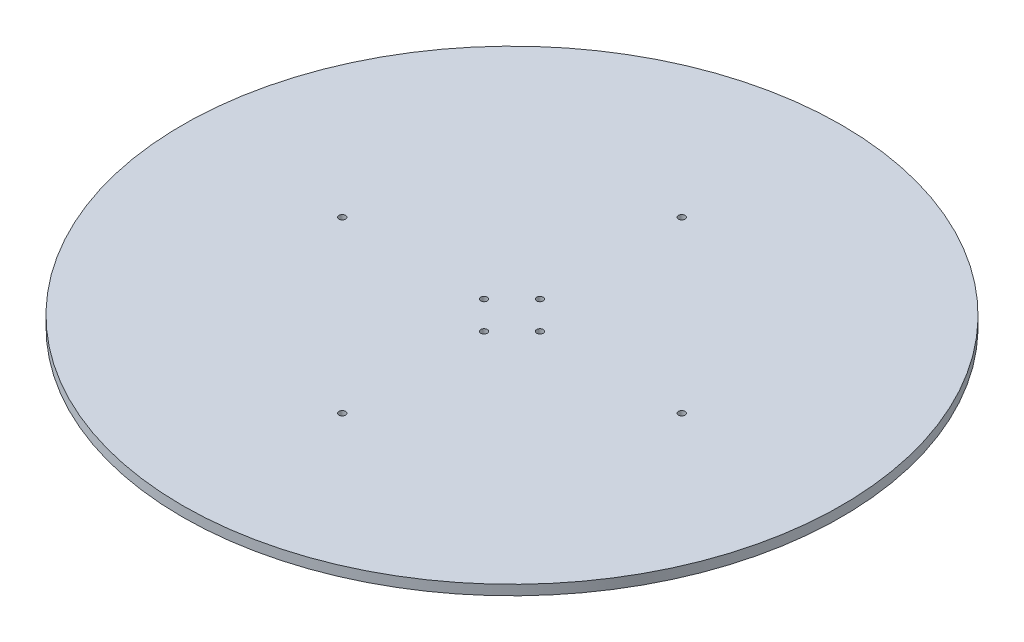
ISO-10303-21;
HEADER;
FILE_DESCRIPTION(('STEP AP214'),'2;1');
FILE_NAME('part.step','',(''),(''),'','','');
FILE_SCHEMA(('AUTOMOTIVE_DESIGN { 1 0 10303 214 1 1 1 1 }'));
ENDSEC;
DATA;
#1=APPLICATION_CONTEXT('core data for automotive mechanical design processes');
#2=APPLICATION_PROTOCOL_DEFINITION('international standard','automotive_design',2000,#1);
#3=PRODUCT_CONTEXT('',#1,'mechanical');
#4=PRODUCT('Part','Part','',(#3));
#5=PRODUCT_RELATED_PRODUCT_CATEGORY('part','',(#4));
#6=PRODUCT_DEFINITION_FORMATION('','',#4);
#7=PRODUCT_DEFINITION_CONTEXT('part definition',#1,'design');
#8=PRODUCT_DEFINITION('design','',#6,#7);
#9=PRODUCT_DEFINITION_SHAPE('','',#8);
#10=(LENGTH_UNIT() NAMED_UNIT(*) SI_UNIT(.MILLI.,.METRE.));
#11=(NAMED_UNIT(*) PLANE_ANGLE_UNIT() SI_UNIT($,.RADIAN.));
#12=(NAMED_UNIT(*) SI_UNIT($,.STERADIAN.) SOLID_ANGLE_UNIT());
#13=UNCERTAINTY_MEASURE_WITH_UNIT(LENGTH_MEASURE(1.E-05),#10,'distance_accuracy_value','');
#14=(GEOMETRIC_REPRESENTATION_CONTEXT(3) GLOBAL_UNCERTAINTY_ASSIGNED_CONTEXT((#13)) GLOBAL_UNIT_ASSIGNED_CONTEXT((#10,
#11,#12)) REPRESENTATION_CONTEXT('',''));
#15=CARTESIAN_POINT('',(0.,0.,0.));
#16=DIRECTION('',(0.,0.,1.));
#17=DIRECTION('',(1.,0.,0.));
#18=AXIS2_PLACEMENT_3D('',#15,#16,#17);
#19=CARTESIAN_POINT('',(0.,5.,0.));
#20=DIRECTION('',(0.,1.,0.));
#21=DIRECTION('',(0.,0.,1.));
#22=AXIS2_PLACEMENT_3D('',#19,#20,#21);
#23=PLANE('',#22);
#24=CARTESIAN_POINT('',(-85.,5.,-5.93551827603333E-13));
#25=DIRECTION('',(0.,1.,0.));
#26=DIRECTION('',(0.,0.,1.));
#27=AXIS2_PLACEMENT_3D('',#24,#25,#26);
#28=CIRCLE('',#27,1.65);
#29=CARTESIAN_POINT('',(-85.,5.,1.64999999999941));
#30=VERTEX_POINT('',#29);
#31=EDGE_CURVE('E79',#30,#30,#28,.T.);
#32=ORIENTED_EDGE('',*,*,#31,.F.);
#33=EDGE_LOOP('',(#32));
#34=FACE_BOUND('',#33,.T.);
#35=CARTESIAN_POINT('',(85.,5.,0.));
#36=DIRECTION('',(0.,1.,0.));
#37=DIRECTION('',(0.,0.,1.));
#38=AXIS2_PLACEMENT_3D('',#35,#36,#37);
#39=CIRCLE('',#38,1.65);
#40=CARTESIAN_POINT('',(85.,5.,1.65));
#41=VERTEX_POINT('',#40);
#42=EDGE_CURVE('E67',#41,#41,#39,.T.);
#43=ORIENTED_EDGE('',*,*,#42,.F.);
#44=EDGE_LOOP('',(#43));
#45=FACE_BOUND('',#44,.T.);
#46=CARTESIAN_POINT('',(-14.,5.,0.));
#47=DIRECTION('',(0.,1.,0.));
#48=DIRECTION('',(0.,0.,1.));
#49=AXIS2_PLACEMENT_3D('',#46,#47,#48);
#50=CIRCLE('',#49,1.65);
#51=CARTESIAN_POINT('',(-14.,5.,1.6499999999999));
#52=VERTEX_POINT('',#51);
#53=EDGE_CURVE('E55',#52,#52,#50,.T.);
#54=ORIENTED_EDGE('',*,*,#53,.F.);
#55=EDGE_LOOP('',(#54));
#56=FACE_BOUND('',#55,.T.);
#57=CARTESIAN_POINT('',(14.,5.,0.));
#58=DIRECTION('',(0.,1.,0.));
#59=DIRECTION('',(0.,0.,1.));
#60=AXIS2_PLACEMENT_3D('',#57,#58,#59);
#61=CIRCLE('',#60,1.65);
#62=CARTESIAN_POINT('',(14.,5.,1.65));
#63=VERTEX_POINT('',#62);
#64=EDGE_CURVE('E44',#63,#63,#61,.T.);
#65=ORIENTED_EDGE('',*,*,#64,.F.);
#66=EDGE_LOOP('',(#65));
#67=FACE_BOUND('',#66,.T.);
#68=CARTESIAN_POINT('',(0.,5.,0.));
#69=DIRECTION('',(0.,1.,0.));
#70=DIRECTION('',(0.,0.,1.));
#71=AXIS2_PLACEMENT_3D('',#68,#69,#70);
#72=CIRCLE('',#71,165.);
#73=CARTESIAN_POINT('',(0.,5.,165.));
#74=VERTEX_POINT('',#73);
#75=EDGE_CURVE('E10',#74,#74,#72,.T.);
#76=ORIENTED_EDGE('',*,*,#75,.T.);
#77=EDGE_LOOP('',(#76));
#78=FACE_BOUND('',#77,.T.);
#79=CARTESIAN_POINT('',(0.,5.,14.));
#80=DIRECTION('',(0.,1.,0.));
#81=DIRECTION('',(0.,0.,1.));
#82=AXIS2_PLACEMENT_3D('',#79,#80,#81);
#83=CIRCLE('',#82,1.65);
#84=CARTESIAN_POINT('',(0.,5.,15.65));
#85=VERTEX_POINT('',#84);
#86=EDGE_CURVE('E49',#85,#85,#83,.T.);
#87=ORIENTED_EDGE('',*,*,#86,.F.);
#88=EDGE_LOOP('',(#87));
#89=FACE_BOUND('',#88,.T.);
#90=CARTESIAN_POINT('',(1.46642216231412E-13,5.,-14.));
#91=DIRECTION('',(0.,1.,0.));
#92=DIRECTION('',(0.,0.,1.));
#93=AXIS2_PLACEMENT_3D('',#90,#91,#92);
#94=CIRCLE('',#93,1.65);
#95=CARTESIAN_POINT('',(1.46642216231412E-13,5.,-12.35));
#96=VERTEX_POINT('',#95);
#97=EDGE_CURVE('E61',#96,#96,#94,.T.);
#98=ORIENTED_EDGE('',*,*,#97,.F.);
#99=EDGE_LOOP('',(#98));
#100=FACE_BOUND('',#99,.T.);
#101=CARTESIAN_POINT('',(-2.96775913801666E-13,5.,85.));
#102=DIRECTION('',(0.,1.,0.));
#103=DIRECTION('',(0.,0.,1.));
#104=AXIS2_PLACEMENT_3D('',#101,#102,#103);
#105=CIRCLE('',#104,1.65);
#106=CARTESIAN_POINT('',(-2.96775913801666E-13,5.,86.65));
#107=VERTEX_POINT('',#106);
#108=EDGE_CURVE('E73',#107,#107,#105,.T.);
#109=ORIENTED_EDGE('',*,*,#108,.F.);
#110=EDGE_LOOP('',(#109));
#111=FACE_BOUND('',#110,.T.);
#112=CARTESIAN_POINT('',(8.90327741404999E-13,5.,-85.));
#113=DIRECTION('',(0.,1.,0.));
#114=DIRECTION('',(0.,0.,1.));
#115=AXIS2_PLACEMENT_3D('',#112,#113,#114);
#116=CIRCLE('',#115,1.65);
#117=CARTESIAN_POINT('',(8.90327741404999E-13,5.,-83.35));
#118=VERTEX_POINT('',#117);
#119=EDGE_CURVE('E85',#118,#118,#116,.T.);
#120=ORIENTED_EDGE('',*,*,#119,.F.);
#121=EDGE_LOOP('',(#120));
#122=FACE_BOUND('',#121,.T.);
#123=ADVANCED_FACE('F33',(#34,#45,#56,#67,#78,#89,#100,#111,#122),#23,.T.);
#124=CARTESIAN_POINT('',(0.,0.,0.));
#125=DIRECTION('',(0.,1.,0.));
#126=DIRECTION('',(0.,0.,1.));
#127=AXIS2_PLACEMENT_3D('',#124,#125,#126);
#128=PLANE('',#127);
#129=CARTESIAN_POINT('',(0.,0.,0.));
#130=DIRECTION('',(0.,1.,0.));
#131=DIRECTION('',(0.,0.,1.));
#132=AXIS2_PLACEMENT_3D('',#129,#130,#131);
#133=CIRCLE('',#132,165.);
#134=CARTESIAN_POINT('',(0.,0.,165.));
#135=VERTEX_POINT('',#134);
#136=EDGE_CURVE('E37',#135,#135,#133,.T.);
#137=ORIENTED_EDGE('',*,*,#136,.F.);
#138=EDGE_LOOP('',(#137));
#139=FACE_BOUND('',#138,.T.);
#140=CARTESIAN_POINT('',(14.,0.,0.));
#141=DIRECTION('',(0.,1.,0.));
#142=DIRECTION('',(0.,0.,1.));
#143=AXIS2_PLACEMENT_3D('',#140,#141,#142);
#144=CIRCLE('',#143,1.65);
#145=CARTESIAN_POINT('',(14.,0.,1.65));
#146=VERTEX_POINT('',#145);
#147=EDGE_CURVE('E46',#146,#146,#144,.T.);
#148=ORIENTED_EDGE('',*,*,#147,.T.);
#149=EDGE_LOOP('',(#148));
#150=FACE_BOUND('',#149,.T.);
#151=CARTESIAN_POINT('',(0.,0.,14.));
#152=DIRECTION('',(0.,1.,0.));
#153=DIRECTION('',(0.,0.,1.));
#154=AXIS2_PLACEMENT_3D('',#151,#152,#153);
#155=CIRCLE('',#154,1.65);
#156=CARTESIAN_POINT('',(0.,0.,15.65));
#157=VERTEX_POINT('',#156);
#158=EDGE_CURVE('E52',#157,#157,#155,.T.);
#159=ORIENTED_EDGE('',*,*,#158,.T.);
#160=EDGE_LOOP('',(#159));
#161=FACE_BOUND('',#160,.T.);
#162=CARTESIAN_POINT('',(-14.,0.,0.));
#163=DIRECTION('',(0.,1.,0.));
#164=DIRECTION('',(0.,0.,1.));
#165=AXIS2_PLACEMENT_3D('',#162,#163,#164);
#166=CIRCLE('',#165,1.65);
#167=CARTESIAN_POINT('',(-14.,0.,1.6499999999999));
#168=VERTEX_POINT('',#167);
#169=EDGE_CURVE('E58',#168,#168,#166,.T.);
#170=ORIENTED_EDGE('',*,*,#169,.T.);
#171=EDGE_LOOP('',(#170));
#172=FACE_BOUND('',#171,.T.);
#173=CARTESIAN_POINT('',(1.46642216231412E-13,0.,-14.));
#174=DIRECTION('',(0.,1.,0.));
#175=DIRECTION('',(0.,0.,1.));
#176=AXIS2_PLACEMENT_3D('',#173,#174,#175);
#177=CIRCLE('',#176,1.65);
#178=CARTESIAN_POINT('',(1.46642216231412E-13,0.,-12.35));
#179=VERTEX_POINT('',#178);
#180=EDGE_CURVE('E64',#179,#179,#177,.T.);
#181=ORIENTED_EDGE('',*,*,#180,.T.);
#182=EDGE_LOOP('',(#181));
#183=FACE_BOUND('',#182,.T.);
#184=CARTESIAN_POINT('',(85.,0.,0.));
#185=DIRECTION('',(0.,1.,0.));
#186=DIRECTION('',(0.,0.,1.));
#187=AXIS2_PLACEMENT_3D('',#184,#185,#186);
#188=CIRCLE('',#187,1.65);
#189=CARTESIAN_POINT('',(85.,0.,1.65));
#190=VERTEX_POINT('',#189);
#191=EDGE_CURVE('E70',#190,#190,#188,.T.);
#192=ORIENTED_EDGE('',*,*,#191,.T.);
#193=EDGE_LOOP('',(#192));
#194=FACE_BOUND('',#193,.T.);
#195=CARTESIAN_POINT('',(-2.96775913801666E-13,0.,85.));
#196=DIRECTION('',(0.,1.,0.));
#197=DIRECTION('',(0.,0.,1.));
#198=AXIS2_PLACEMENT_3D('',#195,#196,#197);
#199=CIRCLE('',#198,1.65);
#200=CARTESIAN_POINT('',(-2.96775913801666E-13,0.,86.65));
#201=VERTEX_POINT('',#200);
#202=EDGE_CURVE('E76',#201,#201,#199,.T.);
#203=ORIENTED_EDGE('',*,*,#202,.T.);
#204=EDGE_LOOP('',(#203));
#205=FACE_BOUND('',#204,.T.);
#206=CARTESIAN_POINT('',(-85.,0.,-5.93551827603333E-13));
#207=DIRECTION('',(0.,1.,0.));
#208=DIRECTION('',(0.,0.,1.));
#209=AXIS2_PLACEMENT_3D('',#206,#207,#208);
#210=CIRCLE('',#209,1.65);
#211=CARTESIAN_POINT('',(-85.,0.,1.64999999999941));
#212=VERTEX_POINT('',#211);
#213=EDGE_CURVE('E82',#212,#212,#210,.T.);
#214=ORIENTED_EDGE('',*,*,#213,.T.);
#215=EDGE_LOOP('',(#214));
#216=FACE_BOUND('',#215,.T.);
#217=CARTESIAN_POINT('',(8.90327741404999E-13,0.,-85.));
#218=DIRECTION('',(0.,1.,0.));
#219=DIRECTION('',(0.,0.,1.));
#220=AXIS2_PLACEMENT_3D('',#217,#218,#219);
#221=CIRCLE('',#220,1.65);
#222=CARTESIAN_POINT('',(8.90327741404999E-13,0.,-83.35));
#223=VERTEX_POINT('',#222);
#224=EDGE_CURVE('E88',#223,#223,#221,.T.);
#225=ORIENTED_EDGE('',*,*,#224,.T.);
#226=EDGE_LOOP('',(#225));
#227=FACE_BOUND('',#226,.T.);
#228=ADVANCED_FACE('F98',(#139,#150,#161,#172,#183,#194,#205,#216,#227),#128,.F.);
#229=CARTESIAN_POINT('',(0.,5.,0.));
#230=DIRECTION('',(0.,-1.,0.));
#231=DIRECTION('',(0.,0.,-1.));
#232=AXIS2_PLACEMENT_3D('',#229,#230,#231);
#233=CYLINDRICAL_SURFACE('',#232,165.);
#234=ORIENTED_EDGE('',*,*,#75,.F.);
#235=EDGE_LOOP('',(#234));
#236=FACE_BOUND('',#235,.T.);
#237=ORIENTED_EDGE('',*,*,#136,.T.);
#238=EDGE_LOOP('',(#237));
#239=FACE_BOUND('',#238,.T.);
#240=ADVANCED_FACE('F35',(#236,#239),#233,.T.);
#241=CARTESIAN_POINT('',(14.,5.,0.));
#242=DIRECTION('',(0.,-1.,0.));
#243=DIRECTION('',(0.,0.,-1.));
#244=AXIS2_PLACEMENT_3D('',#241,#242,#243);
#245=CYLINDRICAL_SURFACE('',#244,1.65);
#246=ORIENTED_EDGE('',*,*,#64,.T.);
#247=EDGE_LOOP('',(#246));
#248=FACE_BOUND('',#247,.T.);
#249=ORIENTED_EDGE('',*,*,#147,.F.);
#250=EDGE_LOOP('',(#249));
#251=FACE_BOUND('',#250,.T.);
#252=ADVANCED_FACE('F108',(#248,#251),#245,.F.);
#253=CARTESIAN_POINT('',(0.,5.,14.));
#254=DIRECTION('',(0.,-1.,0.));
#255=DIRECTION('',(0.,0.,-1.));
#256=AXIS2_PLACEMENT_3D('',#253,#254,#255);
#257=CYLINDRICAL_SURFACE('',#256,1.65);
#258=ORIENTED_EDGE('',*,*,#86,.T.);
#259=EDGE_LOOP('',(#258));
#260=FACE_BOUND('',#259,.T.);
#261=ORIENTED_EDGE('',*,*,#158,.F.);
#262=EDGE_LOOP('',(#261));
#263=FACE_BOUND('',#262,.T.);
#264=ADVANCED_FACE('F111',(#260,#263),#257,.F.);
#265=CARTESIAN_POINT('',(-14.,5.,0.));
#266=DIRECTION('',(0.,-1.,0.));
#267=DIRECTION('',(0.,0.,-1.));
#268=AXIS2_PLACEMENT_3D('',#265,#266,#267);
#269=CYLINDRICAL_SURFACE('',#268,1.65);
#270=ORIENTED_EDGE('',*,*,#53,.T.);
#271=EDGE_LOOP('',(#270));
#272=FACE_BOUND('',#271,.T.);
#273=ORIENTED_EDGE('',*,*,#169,.F.);
#274=EDGE_LOOP('',(#273));
#275=FACE_BOUND('',#274,.T.);
#276=ADVANCED_FACE('F115',(#272,#275),#269,.F.);
#277=CARTESIAN_POINT('',(1.46642216231412E-13,5.,-14.));
#278=DIRECTION('',(0.,-1.,0.));
#279=DIRECTION('',(0.,0.,-1.));
#280=AXIS2_PLACEMENT_3D('',#277,#278,#279);
#281=CYLINDRICAL_SURFACE('',#280,1.65);
#282=ORIENTED_EDGE('',*,*,#97,.T.);
#283=EDGE_LOOP('',(#282));
#284=FACE_BOUND('',#283,.T.);
#285=ORIENTED_EDGE('',*,*,#180,.F.);
#286=EDGE_LOOP('',(#285));
#287=FACE_BOUND('',#286,.T.);
#288=ADVANCED_FACE('F119',(#284,#287),#281,.F.);
#289=CARTESIAN_POINT('',(85.,5.,0.));
#290=DIRECTION('',(0.,-1.,0.));
#291=DIRECTION('',(0.,0.,-1.));
#292=AXIS2_PLACEMENT_3D('',#289,#290,#291);
#293=CYLINDRICAL_SURFACE('',#292,1.65);
#294=ORIENTED_EDGE('',*,*,#42,.T.);
#295=EDGE_LOOP('',(#294));
#296=FACE_BOUND('',#295,.T.);
#297=ORIENTED_EDGE('',*,*,#191,.F.);
#298=EDGE_LOOP('',(#297));
#299=FACE_BOUND('',#298,.T.);
#300=ADVANCED_FACE('F123',(#296,#299),#293,.F.);
#301=CARTESIAN_POINT('',(-2.96775913801666E-13,5.,85.));
#302=DIRECTION('',(0.,-1.,0.));
#303=DIRECTION('',(0.,0.,-1.));
#304=AXIS2_PLACEMENT_3D('',#301,#302,#303);
#305=CYLINDRICAL_SURFACE('',#304,1.65);
#306=ORIENTED_EDGE('',*,*,#108,.T.);
#307=EDGE_LOOP('',(#306));
#308=FACE_BOUND('',#307,.T.);
#309=ORIENTED_EDGE('',*,*,#202,.F.);
#310=EDGE_LOOP('',(#309));
#311=FACE_BOUND('',#310,.T.);
#312=ADVANCED_FACE('F127',(#308,#311),#305,.F.);
#313=CARTESIAN_POINT('',(-85.,5.,-5.93551827603333E-13));
#314=DIRECTION('',(0.,-1.,0.));
#315=DIRECTION('',(0.,0.,-1.));
#316=AXIS2_PLACEMENT_3D('',#313,#314,#315);
#317=CYLINDRICAL_SURFACE('',#316,1.65);
#318=ORIENTED_EDGE('',*,*,#31,.T.);
#319=EDGE_LOOP('',(#318));
#320=FACE_BOUND('',#319,.T.);
#321=ORIENTED_EDGE('',*,*,#213,.F.);
#322=EDGE_LOOP('',(#321));
#323=FACE_BOUND('',#322,.T.);
#324=ADVANCED_FACE('F131',(#320,#323),#317,.F.);
#325=CARTESIAN_POINT('',(8.90327741404999E-13,5.,-85.));
#326=DIRECTION('',(0.,-1.,0.));
#327=DIRECTION('',(0.,0.,-1.));
#328=AXIS2_PLACEMENT_3D('',#325,#326,#327);
#329=CYLINDRICAL_SURFACE('',#328,1.65);
#330=ORIENTED_EDGE('',*,*,#119,.T.);
#331=EDGE_LOOP('',(#330));
#332=FACE_BOUND('',#331,.T.);
#333=ORIENTED_EDGE('',*,*,#224,.F.);
#334=EDGE_LOOP('',(#333));
#335=FACE_BOUND('',#334,.T.);
#336=ADVANCED_FACE('F94',(#332,#335),#329,.F.);
#337=CLOSED_SHELL('',(#123,#228,#240,#252,#264,#276,#288,#300,#312,#324,#336));
#338=MANIFOLD_SOLID_BREP('B2',#337);
#339=ADVANCED_BREP_SHAPE_REPRESENTATION('',(#18,#338),#14);
#340=SHAPE_DEFINITION_REPRESENTATION(#9,#339);
ENDSEC;
END-ISO-10303-21;
